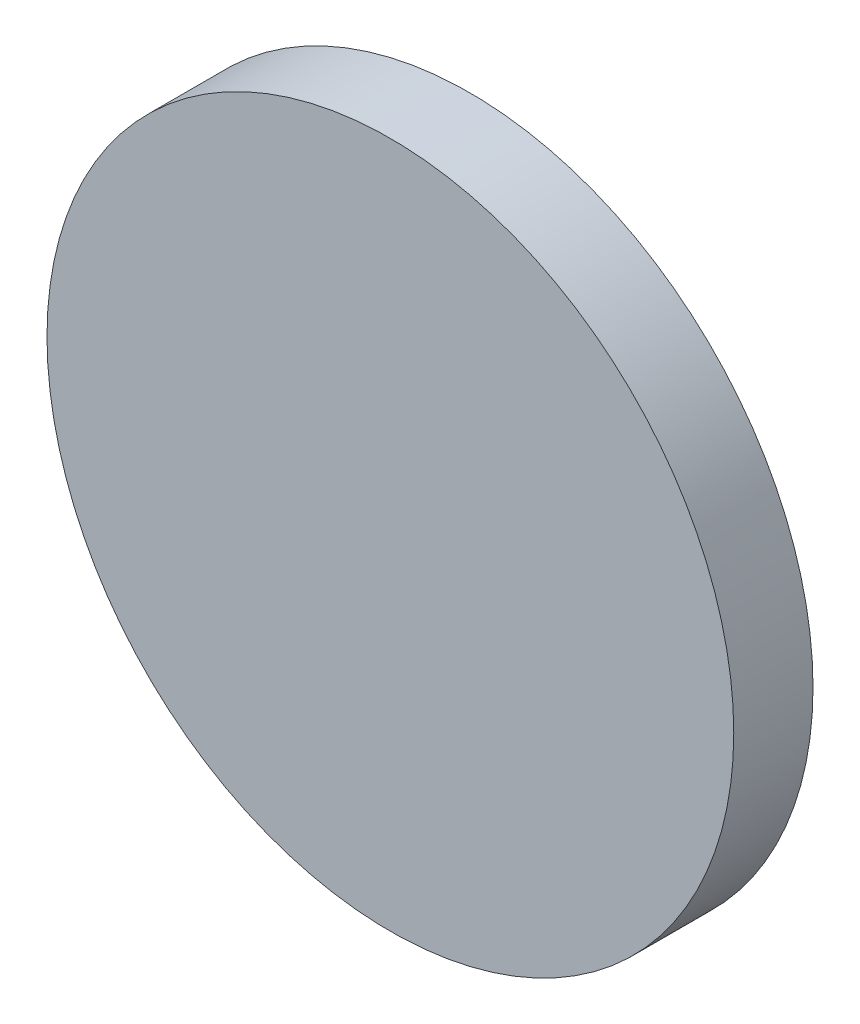
ISO-10303-21;
HEADER;
FILE_DESCRIPTION(('STEP AP214'),'2;1');
FILE_NAME('part.step','',(''),(''),'','','');
FILE_SCHEMA(('AUTOMOTIVE_DESIGN { 1 0 10303 214 1 1 1 1 }'));
ENDSEC;
DATA;
#1=APPLICATION_CONTEXT('core data for automotive mechanical design processes');
#2=APPLICATION_PROTOCOL_DEFINITION('international standard','automotive_design',2000,#1);
#3=PRODUCT_CONTEXT('',#1,'mechanical');
#4=PRODUCT('Part','Part','',(#3));
#5=PRODUCT_RELATED_PRODUCT_CATEGORY('part','',(#4));
#6=PRODUCT_DEFINITION_FORMATION('','',#4);
#7=PRODUCT_DEFINITION_CONTEXT('part definition',#1,'design');
#8=PRODUCT_DEFINITION('design','',#6,#7);
#9=PRODUCT_DEFINITION_SHAPE('','',#8);
#10=(LENGTH_UNIT() NAMED_UNIT(*) SI_UNIT(.MILLI.,.METRE.));
#11=(NAMED_UNIT(*) PLANE_ANGLE_UNIT() SI_UNIT($,.RADIAN.));
#12=(NAMED_UNIT(*) SI_UNIT($,.STERADIAN.) SOLID_ANGLE_UNIT());
#13=UNCERTAINTY_MEASURE_WITH_UNIT(LENGTH_MEASURE(1.E-05),#10,'distance_accuracy_value','');
#14=(GEOMETRIC_REPRESENTATION_CONTEXT(3) GLOBAL_UNCERTAINTY_ASSIGNED_CONTEXT((#13)) GLOBAL_UNIT_ASSIGNED_CONTEXT((#10,
#11,#12)) REPRESENTATION_CONTEXT('',''));
#15=CARTESIAN_POINT('',(0.,0.,0.));
#16=DIRECTION('',(0.,0.,1.));
#17=DIRECTION('',(1.,0.,0.));
#18=AXIS2_PLACEMENT_3D('',#15,#16,#17);
#19=CARTESIAN_POINT('',(0.,0.,3.));
#20=DIRECTION('',(0.,0.,-1.));
#21=DIRECTION('',(-1.,0.,0.));
#22=AXIS2_PLACEMENT_3D('',#19,#20,#21);
#23=CYLINDRICAL_SURFACE('',#22,13.);
#24=CARTESIAN_POINT('',(0.,0.,3.));
#25=DIRECTION('',(0.,0.,1.));
#26=DIRECTION('',(1.,0.,0.));
#27=AXIS2_PLACEMENT_3D('',#24,#25,#26);
#28=CIRCLE('',#27,13.);
#29=CARTESIAN_POINT('',(13.,0.,3.));
#30=VERTEX_POINT('',#29);
#31=EDGE_CURVE('E10',#30,#30,#28,.T.);
#32=ORIENTED_EDGE('',*,*,#31,.F.);
#33=EDGE_LOOP('',(#32));
#34=FACE_BOUND('',#33,.T.);
#35=CARTESIAN_POINT('',(0.,0.,0.));
#36=DIRECTION('',(0.,0.,1.));
#37=DIRECTION('',(1.,0.,0.));
#38=AXIS2_PLACEMENT_3D('',#35,#36,#37);
#39=CIRCLE('',#38,13.);
#40=CARTESIAN_POINT('',(13.,0.,0.));
#41=VERTEX_POINT('',#40);
#42=EDGE_CURVE('E37',#41,#41,#39,.T.);
#43=ORIENTED_EDGE('',*,*,#42,.T.);
#44=EDGE_LOOP('',(#43));
#45=FACE_BOUND('',#44,.T.);
#46=ADVANCED_FACE('F34',(#34,#45),#23,.T.);
#47=CARTESIAN_POINT('',(0.,0.,3.));
#48=DIRECTION('',(0.,0.,1.));
#49=DIRECTION('',(1.,0.,0.));
#50=AXIS2_PLACEMENT_3D('',#47,#48,#49);
#51=PLANE('',#50);
#52=ORIENTED_EDGE('',*,*,#31,.T.);
#53=EDGE_LOOP('',(#52));
#54=FACE_BOUND('',#53,.T.);
#55=ADVANCED_FACE('F49',(#54),#51,.T.);
#56=CARTESIAN_POINT('',(0.,0.,0.));
#57=DIRECTION('',(0.,0.,1.));
#58=DIRECTION('',(1.,0.,0.));
#59=AXIS2_PLACEMENT_3D('',#56,#57,#58);
#60=PLANE('',#59);
#61=ORIENTED_EDGE('',*,*,#42,.F.);
#62=EDGE_LOOP('',(#61));
#63=FACE_BOUND('',#62,.T.);
#64=ADVANCED_FACE('F47',(#63),#60,.F.);
#65=CLOSED_SHELL('',(#46,#55,#64));
#66=MANIFOLD_SOLID_BREP('B2',#65);
#67=ADVANCED_BREP_SHAPE_REPRESENTATION('',(#18,#66),#14);
#68=SHAPE_DEFINITION_REPRESENTATION(#9,#67);
ENDSEC;
END-ISO-10303-21;
